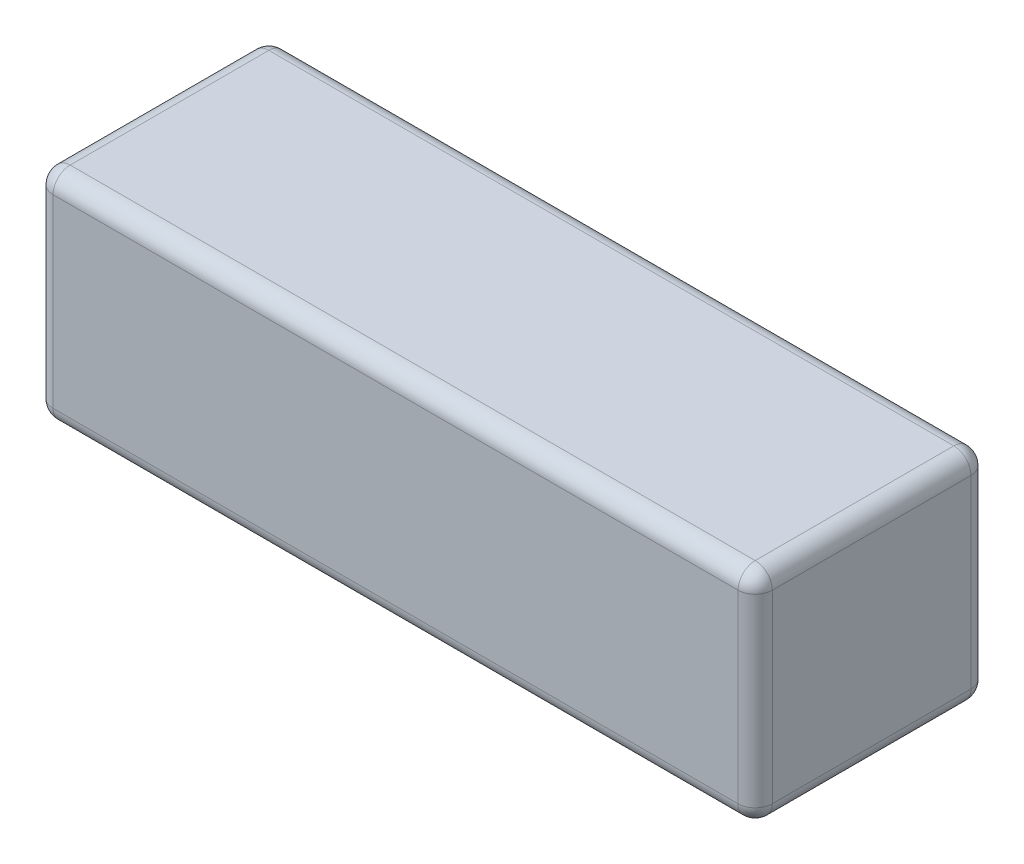
ISO-10303-21;
HEADER;
FILE_DESCRIPTION(('STEP AP214'),'2;1');
FILE_NAME('part.step','',(''),(''),'','','');
FILE_SCHEMA(('AUTOMOTIVE_DESIGN { 1 0 10303 214 1 1 1 1 }'));
ENDSEC;
DATA;
#1=APPLICATION_CONTEXT('core data for automotive mechanical design processes');
#2=APPLICATION_PROTOCOL_DEFINITION('international standard','automotive_design',2000,#1);
#3=PRODUCT_CONTEXT('',#1,'mechanical');
#4=PRODUCT('Part','Part','',(#3));
#5=PRODUCT_RELATED_PRODUCT_CATEGORY('part','',(#4));
#6=PRODUCT_DEFINITION_FORMATION('','',#4);
#7=PRODUCT_DEFINITION_CONTEXT('part definition',#1,'design');
#8=PRODUCT_DEFINITION('design','',#6,#7);
#9=PRODUCT_DEFINITION_SHAPE('','',#8);
#10=(LENGTH_UNIT() NAMED_UNIT(*) SI_UNIT(.MILLI.,.METRE.));
#11=(NAMED_UNIT(*) PLANE_ANGLE_UNIT() SI_UNIT($,.RADIAN.));
#12=(NAMED_UNIT(*) SI_UNIT($,.STERADIAN.) SOLID_ANGLE_UNIT());
#13=UNCERTAINTY_MEASURE_WITH_UNIT(LENGTH_MEASURE(1.E-05),#10,'distance_accuracy_value','');
#14=(GEOMETRIC_REPRESENTATION_CONTEXT(3) GLOBAL_UNCERTAINTY_ASSIGNED_CONTEXT((#13)) GLOBAL_UNIT_ASSIGNED_CONTEXT((#10,
#11,#12)) REPRESENTATION_CONTEXT('',''));
#15=CARTESIAN_POINT('',(0.,0.,0.));
#16=DIRECTION('',(0.,0.,1.));
#17=DIRECTION('',(1.,0.,0.));
#18=AXIS2_PLACEMENT_3D('',#15,#16,#17);
#19=CARTESIAN_POINT('',(0.,32.,0.));
#20=DIRECTION('',(1.,0.,0.));
#21=DIRECTION('',(0.,0.,-1.));
#22=AXIS2_PLACEMENT_3D('',#19,#20,#21);
#23=PLANE('',#22);
#24=DIRECTION('',(0.,0.,1.));
#25=VECTOR('',#24,1.);
#26=CARTESIAN_POINT('',(0.,2.5,0.));
#27=LINE('',#26,#25);
#28=CARTESIAN_POINT('',(0.,2.5,-31.5));
#29=VERTEX_POINT('',#28);
#30=CARTESIAN_POINT('',(0.,2.5,-2.5));
#31=VERTEX_POINT('',#30);
#32=EDGE_CURVE('E220',#29,#31,#27,.T.);
#33=ORIENTED_EDGE('',*,*,#32,.T.);
#34=DIRECTION('',(0.,-1.,0.));
#35=VECTOR('',#34,1.);
#36=CARTESIAN_POINT('',(0.,32.,-2.5));
#37=LINE('',#36,#35);
#38=CARTESIAN_POINT('',(0.,29.5,-2.5));
#39=VERTEX_POINT('',#38);
#40=EDGE_CURVE('E224',#31,#39,#37,.F.);
#41=ORIENTED_EDGE('',*,*,#40,.T.);
#42=DIRECTION('',(0.,0.,1.));
#43=VECTOR('',#42,1.);
#44=CARTESIAN_POINT('',(0.,29.5,0.));
#45=LINE('',#44,#43);
#46=CARTESIAN_POINT('',(0.,29.5,-31.5));
#47=VERTEX_POINT('',#46);
#48=EDGE_CURVE('E217',#39,#47,#45,.F.);
#49=ORIENTED_EDGE('',*,*,#48,.T.);
#50=DIRECTION('',(0.,-1.,0.));
#51=VECTOR('',#50,1.);
#52=CARTESIAN_POINT('',(0.,32.,-31.5));
#53=LINE('',#52,#51);
#54=EDGE_CURVE('E214',#47,#29,#53,.T.);
#55=ORIENTED_EDGE('',*,*,#54,.T.);
#56=EDGE_LOOP('',(#33,#41,#49,#55));
#57=FACE_BOUND('',#56,.T.);
#58=ADVANCED_FACE('F43',(#57),#23,.F.);
#59=CARTESIAN_POINT('',(0.,32.,0.));
#60=DIRECTION('',(0.,0.,-1.));
#61=DIRECTION('',(-1.,0.,0.));
#62=AXIS2_PLACEMENT_3D('',#59,#60,#61);
#63=PLANE('',#62);
#64=DIRECTION('',(1.,0.,0.));
#65=VECTOR('',#64,1.);
#66=CARTESIAN_POINT('',(0.,29.5,0.));
#67=LINE('',#66,#65);
#68=CARTESIAN_POINT('',(102.5,29.5,0.));
#69=VERTEX_POINT('',#68);
#70=CARTESIAN_POINT('',(2.5,29.5,0.));
#71=VERTEX_POINT('',#70);
#72=EDGE_CURVE('E164',#69,#71,#67,.F.);
#73=ORIENTED_EDGE('',*,*,#72,.T.);
#74=DIRECTION('',(0.,-1.,0.));
#75=VECTOR('',#74,1.);
#76=CARTESIAN_POINT('',(2.5,32.,0.));
#77=LINE('',#76,#75);
#78=CARTESIAN_POINT('',(2.5,2.5,0.));
#79=VERTEX_POINT('',#78);
#80=EDGE_CURVE('E168',#71,#79,#77,.T.);
#81=ORIENTED_EDGE('',*,*,#80,.T.);
#82=DIRECTION('',(1.,0.,0.));
#83=VECTOR('',#82,1.);
#84=CARTESIAN_POINT('',(105.,2.5,0.));
#85=LINE('',#84,#83);
#86=CARTESIAN_POINT('',(102.5,2.5,0.));
#87=VERTEX_POINT('',#86);
#88=EDGE_CURVE('E137',#79,#87,#85,.T.);
#89=ORIENTED_EDGE('',*,*,#88,.T.);
#90=DIRECTION('',(0.,-1.,0.));
#91=VECTOR('',#90,1.);
#92=CARTESIAN_POINT('',(102.5,32.,0.));
#93=LINE('',#92,#91);
#94=EDGE_CURVE('E157',#87,#69,#93,.F.);
#95=ORIENTED_EDGE('',*,*,#94,.T.);
#96=EDGE_LOOP('',(#73,#81,#89,#95));
#97=FACE_BOUND('',#96,.T.);
#98=ADVANCED_FACE('F166',(#97),#63,.F.);
#99=CARTESIAN_POINT('',(105.,32.,0.));
#100=DIRECTION('',(-1.,0.,0.));
#101=DIRECTION('',(0.,0.,1.));
#102=AXIS2_PLACEMENT_3D('',#99,#100,#101);
#103=PLANE('',#102);
#104=DIRECTION('',(0.,0.,-1.));
#105=VECTOR('',#104,1.);
#106=CARTESIAN_POINT('',(105.,29.5,0.));
#107=LINE('',#106,#105);
#108=CARTESIAN_POINT('',(105.,29.5,-31.5));
#109=VERTEX_POINT('',#108);
#110=CARTESIAN_POINT('',(105.,29.5,-2.5));
#111=VERTEX_POINT('',#110);
#112=EDGE_CURVE('E191',#109,#111,#107,.F.);
#113=ORIENTED_EDGE('',*,*,#112,.T.);
#114=DIRECTION('',(0.,-1.,0.));
#115=VECTOR('',#114,1.);
#116=CARTESIAN_POINT('',(105.,32.,-2.5));
#117=LINE('',#116,#115);
#118=CARTESIAN_POINT('',(105.,2.5,-2.5));
#119=VERTEX_POINT('',#118);
#120=EDGE_CURVE('E198',#111,#119,#117,.T.);
#121=ORIENTED_EDGE('',*,*,#120,.T.);
#122=DIRECTION('',(0.,0.,-1.));
#123=VECTOR('',#122,1.);
#124=CARTESIAN_POINT('',(105.,2.5,-34.));
#125=LINE('',#124,#123);
#126=CARTESIAN_POINT('',(105.,2.5,-31.5));
#127=VERTEX_POINT('',#126);
#128=EDGE_CURVE('E194',#119,#127,#125,.T.);
#129=ORIENTED_EDGE('',*,*,#128,.T.);
#130=DIRECTION('',(0.,-1.,0.));
#131=VECTOR('',#130,1.);
#132=CARTESIAN_POINT('',(105.,32.,-31.5));
#133=LINE('',#132,#131);
#134=EDGE_CURVE('E188',#127,#109,#133,.F.);
#135=ORIENTED_EDGE('',*,*,#134,.T.);
#136=EDGE_LOOP('',(#113,#121,#129,#135));
#137=FACE_BOUND('',#136,.T.);
#138=ADVANCED_FACE('F385',(#137),#103,.F.);
#139=CARTESIAN_POINT('',(0.,32.,-34.));
#140=DIRECTION('',(0.,0.,1.));
#141=DIRECTION('',(1.,0.,0.));
#142=AXIS2_PLACEMENT_3D('',#139,#140,#141);
#143=PLANE('',#142);
#144=DIRECTION('',(-1.,0.,0.));
#145=VECTOR('',#144,1.);
#146=CARTESIAN_POINT('',(0.,2.5,-34.));
#147=LINE('',#146,#145);
#148=CARTESIAN_POINT('',(102.5,2.5,-34.));
#149=VERTEX_POINT('',#148);
#150=CARTESIAN_POINT('',(2.5,2.5,-34.));
#151=VERTEX_POINT('',#150);
#152=EDGE_CURVE('E207',#149,#151,#147,.T.);
#153=ORIENTED_EDGE('',*,*,#152,.T.);
#154=DIRECTION('',(0.,-1.,0.));
#155=VECTOR('',#154,1.);
#156=CARTESIAN_POINT('',(2.5,32.,-34.));
#157=LINE('',#156,#155);
#158=CARTESIAN_POINT('',(2.5,29.5,-34.));
#159=VERTEX_POINT('',#158);
#160=EDGE_CURVE('E211',#151,#159,#157,.F.);
#161=ORIENTED_EDGE('',*,*,#160,.T.);
#162=DIRECTION('',(-1.,0.,0.));
#163=VECTOR('',#162,1.);
#164=CARTESIAN_POINT('',(0.,29.5,-34.));
#165=LINE('',#164,#163);
#166=CARTESIAN_POINT('',(102.5,29.5,-34.));
#167=VERTEX_POINT('',#166);
#168=EDGE_CURVE('E204',#159,#167,#165,.F.);
#169=ORIENTED_EDGE('',*,*,#168,.T.);
#170=DIRECTION('',(0.,-1.,0.));
#171=VECTOR('',#170,1.);
#172=CARTESIAN_POINT('',(102.5,32.,-34.));
#173=LINE('',#172,#171);
#174=EDGE_CURVE('E201',#167,#149,#173,.T.);
#175=ORIENTED_EDGE('',*,*,#174,.T.);
#176=EDGE_LOOP('',(#153,#161,#169,#175));
#177=FACE_BOUND('',#176,.T.);
#178=ADVANCED_FACE('F352',(#177),#143,.F.);
#179=CARTESIAN_POINT('',(0.,32.,0.));
#180=DIRECTION('',(0.,-1.,0.));
#181=DIRECTION('',(0.,0.,-1.));
#182=AXIS2_PLACEMENT_3D('',#179,#180,#181);
#183=PLANE('',#182);
#184=DIRECTION('',(0.,0.,-1.));
#185=VECTOR('',#184,1.);
#186=CARTESIAN_POINT('',(102.5,32.,0.));
#187=LINE('',#186,#185);
#188=CARTESIAN_POINT('',(102.5,32.,-2.5));
#189=VERTEX_POINT('',#188);
#190=CARTESIAN_POINT('',(102.5,32.,-31.5));
#191=VERTEX_POINT('',#190);
#192=EDGE_CURVE('E53',#189,#191,#187,.T.);
#193=ORIENTED_EDGE('',*,*,#192,.T.);
#194=DIRECTION('',(-1.,0.,0.));
#195=VECTOR('',#194,1.);
#196=CARTESIAN_POINT('',(0.,32.,-31.5));
#197=LINE('',#196,#195);
#198=CARTESIAN_POINT('',(2.5,32.,-31.5));
#199=VERTEX_POINT('',#198);
#200=EDGE_CURVE('E11',#191,#199,#197,.T.);
#201=ORIENTED_EDGE('',*,*,#200,.T.);
#202=DIRECTION('',(0.,0.,1.));
#203=VECTOR('',#202,1.);
#204=CARTESIAN_POINT('',(2.5,32.,0.));
#205=LINE('',#204,#203);
#206=CARTESIAN_POINT('',(2.5,32.,-2.5));
#207=VERTEX_POINT('',#206);
#208=EDGE_CURVE('E227',#199,#207,#205,.T.);
#209=ORIENTED_EDGE('',*,*,#208,.T.);
#210=DIRECTION('',(1.,0.,0.));
#211=VECTOR('',#210,1.);
#212=CARTESIAN_POINT('',(0.,32.,-2.5));
#213=LINE('',#212,#211);
#214=EDGE_CURVE('E64',#207,#189,#213,.T.);
#215=ORIENTED_EDGE('',*,*,#214,.T.);
#216=EDGE_LOOP('',(#193,#201,#209,#215));
#217=FACE_BOUND('',#216,.T.);
#218=ADVANCED_FACE('F332',(#217),#183,.F.);
#219=CARTESIAN_POINT('',(0.,0.,0.));
#220=DIRECTION('',(0.,-1.,0.));
#221=DIRECTION('',(0.,0.,-1.));
#222=AXIS2_PLACEMENT_3D('',#219,#220,#221);
#223=PLANE('',#222);
#224=DIRECTION('',(0.,0.,-1.));
#225=VECTOR('',#224,1.);
#226=CARTESIAN_POINT('',(102.5,0.,0.));
#227=LINE('',#226,#225);
#228=CARTESIAN_POINT('',(102.5,0.,-31.5));
#229=VERTEX_POINT('',#228);
#230=CARTESIAN_POINT('',(102.5,0.,-2.5));
#231=VERTEX_POINT('',#230);
#232=EDGE_CURVE('E183',#229,#231,#227,.F.);
#233=ORIENTED_EDGE('',*,*,#232,.T.);
#234=DIRECTION('',(1.,0.,0.));
#235=VECTOR('',#234,1.);
#236=CARTESIAN_POINT('',(0.,0.,-2.5));
#237=LINE('',#236,#235);
#238=CARTESIAN_POINT('',(2.5,0.,-2.5));
#239=VERTEX_POINT('',#238);
#240=EDGE_CURVE('E139',#231,#239,#237,.F.);
#241=ORIENTED_EDGE('',*,*,#240,.T.);
#242=DIRECTION('',(0.,0.,1.));
#243=VECTOR('',#242,1.);
#244=CARTESIAN_POINT('',(2.5,0.,-34.));
#245=LINE('',#244,#243);
#246=CARTESIAN_POINT('',(2.5,0.,-31.5));
#247=VERTEX_POINT('',#246);
#248=EDGE_CURVE('E174',#239,#247,#245,.F.);
#249=ORIENTED_EDGE('',*,*,#248,.T.);
#250=DIRECTION('',(-1.,0.,0.));
#251=VECTOR('',#250,1.);
#252=CARTESIAN_POINT('',(105.,0.,-31.5));
#253=LINE('',#252,#251);
#254=EDGE_CURVE('E180',#247,#229,#253,.F.);
#255=ORIENTED_EDGE('',*,*,#254,.T.);
#256=EDGE_LOOP('',(#233,#241,#249,#255));
#257=FACE_BOUND('',#256,.T.);
#258=ADVANCED_FACE('F413',(#257),#223,.T.);
#259=CARTESIAN_POINT('',(0.,29.5,-31.5));
#260=DIRECTION('',(-1.,0.,0.));
#261=DIRECTION('',(0.,0.,1.));
#262=AXIS2_PLACEMENT_3D('',#259,#260,#261);
#263=CYLINDRICAL_SURFACE('',#262,2.5);
#264=CARTESIAN_POINT('',(2.5,29.5,-31.5));
#265=DIRECTION('',(-1.,0.,0.));
#266=DIRECTION('',(0.,0.,1.));
#267=AXIS2_PLACEMENT_3D('',#264,#265,#266);
#268=CIRCLE('',#267,2.5);
#269=EDGE_CURVE('E47',#199,#159,#268,.T.);
#270=ORIENTED_EDGE('',*,*,#269,.F.);
#271=ORIENTED_EDGE('',*,*,#200,.F.);
#272=CARTESIAN_POINT('',(102.5,29.5,-31.5));
#273=DIRECTION('',(1.,0.,0.));
#274=DIRECTION('',(0.,0.,-1.));
#275=AXIS2_PLACEMENT_3D('',#272,#273,#274);
#276=CIRCLE('',#275,2.5);
#277=EDGE_CURVE('E303',#167,#191,#276,.T.);
#278=ORIENTED_EDGE('',*,*,#277,.F.);
#279=ORIENTED_EDGE('',*,*,#168,.F.);
#280=EDGE_LOOP('',(#270,#271,#278,#279));
#281=FACE_BOUND('',#280,.T.);
#282=ADVANCED_FACE('F45',(#281),#263,.T.);
#283=CARTESIAN_POINT('',(2.5,29.5,-31.5));
#284=DIRECTION('',(0.,0.,-1.));
#285=DIRECTION('',(-1.,0.,0.));
#286=AXIS2_PLACEMENT_3D('',#283,#284,#285);
#287=SPHERICAL_SURFACE('',#286,2.5);
#288=CARTESIAN_POINT('',(2.5,29.5,-31.5));
#289=DIRECTION('',(0.,0.,-1.));
#290=DIRECTION('',(-1.,0.,0.));
#291=AXIS2_PLACEMENT_3D('',#288,#289,#290);
#292=CIRCLE('',#291,2.5);
#293=EDGE_CURVE('E296',#199,#47,#292,.F.);
#294=ORIENTED_EDGE('',*,*,#293,.F.);
#295=ORIENTED_EDGE('',*,*,#269,.T.);
#296=CARTESIAN_POINT('',(2.5,29.5,-31.5));
#297=DIRECTION('',(0.,1.,0.));
#298=DIRECTION('',(0.,0.,1.));
#299=AXIS2_PLACEMENT_3D('',#296,#297,#298);
#300=CIRCLE('',#299,2.5);
#301=EDGE_CURVE('E300',#47,#159,#300,.F.);
#302=ORIENTED_EDGE('',*,*,#301,.F.);
#303=EDGE_LOOP('',(#294,#295,#302));
#304=FACE_BOUND('',#303,.T.);
#305=ADVANCED_FACE('F316',(#304),#287,.T.);
#306=CARTESIAN_POINT('',(102.5,29.5,-31.5));
#307=DIRECTION('',(0.,1.,0.));
#308=DIRECTION('',(0.,0.,1.));
#309=AXIS2_PLACEMENT_3D('',#306,#307,#308);
#310=SPHERICAL_SURFACE('',#309,2.5);
#311=CARTESIAN_POINT('',(102.5,29.5,-31.5));
#312=DIRECTION('',(0.,1.,0.));
#313=DIRECTION('',(0.,0.,1.));
#314=AXIS2_PLACEMENT_3D('',#311,#312,#313);
#315=CIRCLE('',#314,2.5);
#316=EDGE_CURVE('E288',#167,#109,#315,.F.);
#317=ORIENTED_EDGE('',*,*,#316,.F.);
#318=ORIENTED_EDGE('',*,*,#277,.T.);
#319=CARTESIAN_POINT('',(102.5,29.5,-31.5));
#320=DIRECTION('',(0.,0.,-1.));
#321=DIRECTION('',(-1.,0.,0.));
#322=AXIS2_PLACEMENT_3D('',#319,#320,#321);
#323=CIRCLE('',#322,2.5);
#324=EDGE_CURVE('E292',#109,#191,#323,.F.);
#325=ORIENTED_EDGE('',*,*,#324,.F.);
#326=EDGE_LOOP('',(#317,#318,#325));
#327=FACE_BOUND('',#326,.T.);
#328=ADVANCED_FACE('F344',(#327),#310,.T.);
#329=CARTESIAN_POINT('',(2.5,32.,-31.5));
#330=DIRECTION('',(0.,-1.,0.));
#331=DIRECTION('',(0.,0.,-1.));
#332=AXIS2_PLACEMENT_3D('',#329,#330,#331);
#333=CYLINDRICAL_SURFACE('',#332,2.5);
#334=ORIENTED_EDGE('',*,*,#301,.T.);
#335=ORIENTED_EDGE('',*,*,#160,.F.);
#336=CARTESIAN_POINT('',(2.5,2.5,-31.5));
#337=DIRECTION('',(0.,-1.,0.));
#338=DIRECTION('',(0.,0.,-1.));
#339=AXIS2_PLACEMENT_3D('',#336,#337,#338);
#340=CIRCLE('',#339,2.5);
#341=EDGE_CURVE('E281',#29,#151,#340,.T.);
#342=ORIENTED_EDGE('',*,*,#341,.F.);
#343=ORIENTED_EDGE('',*,*,#54,.F.);
#344=EDGE_LOOP('',(#334,#335,#342,#343));
#345=FACE_BOUND('',#344,.T.);
#346=ADVANCED_FACE('F322',(#345),#333,.T.);
#347=CARTESIAN_POINT('',(2.5,29.5,0.));
#348=DIRECTION('',(0.,0.,1.));
#349=DIRECTION('',(1.,0.,0.));
#350=AXIS2_PLACEMENT_3D('',#347,#348,#349);
#351=CYLINDRICAL_SURFACE('',#350,2.5);
#352=ORIENTED_EDGE('',*,*,#293,.T.);
#353=ORIENTED_EDGE('',*,*,#48,.F.);
#354=CARTESIAN_POINT('',(2.5,29.5,-2.5));
#355=DIRECTION('',(0.,0.,1.));
#356=DIRECTION('',(1.,0.,0.));
#357=AXIS2_PLACEMENT_3D('',#354,#355,#356);
#358=CIRCLE('',#357,2.5);
#359=EDGE_CURVE('E277',#207,#39,#358,.T.);
#360=ORIENTED_EDGE('',*,*,#359,.F.);
#361=ORIENTED_EDGE('',*,*,#208,.F.);
#362=EDGE_LOOP('',(#352,#353,#360,#361));
#363=FACE_BOUND('',#362,.T.);
#364=ADVANCED_FACE('F331',(#363),#351,.T.);
#365=CARTESIAN_POINT('',(0.,29.5,-2.5));
#366=DIRECTION('',(1.,0.,0.));
#367=DIRECTION('',(0.,0.,-1.));
#368=AXIS2_PLACEMENT_3D('',#365,#366,#367);
#369=CYLINDRICAL_SURFACE('',#368,2.5);
#370=CARTESIAN_POINT('',(102.5,29.5,-2.5));
#371=DIRECTION('',(1.,0.,0.));
#372=DIRECTION('',(0.,0.,-1.));
#373=AXIS2_PLACEMENT_3D('',#370,#371,#372);
#374=CIRCLE('',#373,2.5);
#375=EDGE_CURVE('E269',#189,#69,#374,.T.);
#376=ORIENTED_EDGE('',*,*,#375,.F.);
#377=ORIENTED_EDGE('',*,*,#214,.F.);
#378=CARTESIAN_POINT('',(2.5,29.5,-2.5));
#379=DIRECTION('',(-1.,0.,0.));
#380=DIRECTION('',(0.,0.,1.));
#381=AXIS2_PLACEMENT_3D('',#378,#379,#380);
#382=CIRCLE('',#381,2.5);
#383=EDGE_CURVE('E273',#71,#207,#382,.T.);
#384=ORIENTED_EDGE('',*,*,#383,.F.);
#385=ORIENTED_EDGE('',*,*,#72,.F.);
#386=EDGE_LOOP('',(#376,#377,#384,#385));
#387=FACE_BOUND('',#386,.T.);
#388=ADVANCED_FACE('F336',(#387),#369,.T.);
#389=CARTESIAN_POINT('',(102.5,29.5,0.));
#390=DIRECTION('',(0.,0.,-1.));
#391=DIRECTION('',(-1.,0.,0.));
#392=AXIS2_PLACEMENT_3D('',#389,#390,#391);
#393=CYLINDRICAL_SURFACE('',#392,2.5);
#394=ORIENTED_EDGE('',*,*,#324,.T.);
#395=ORIENTED_EDGE('',*,*,#192,.F.);
#396=CARTESIAN_POINT('',(102.5,29.5,-2.5));
#397=DIRECTION('',(0.,0.,1.));
#398=DIRECTION('',(1.,0.,0.));
#399=AXIS2_PLACEMENT_3D('',#396,#397,#398);
#400=CIRCLE('',#399,2.5);
#401=EDGE_CURVE('E265',#111,#189,#400,.T.);
#402=ORIENTED_EDGE('',*,*,#401,.F.);
#403=ORIENTED_EDGE('',*,*,#112,.F.);
#404=EDGE_LOOP('',(#394,#395,#402,#403));
#405=FACE_BOUND('',#404,.T.);
#406=ADVANCED_FACE('F343',(#405),#393,.T.);
#407=CARTESIAN_POINT('',(102.5,32.,-31.5));
#408=DIRECTION('',(0.,-1.,0.));
#409=DIRECTION('',(0.,0.,-1.));
#410=AXIS2_PLACEMENT_3D('',#407,#408,#409);
#411=CYLINDRICAL_SURFACE('',#410,2.5);
#412=ORIENTED_EDGE('',*,*,#316,.T.);
#413=ORIENTED_EDGE('',*,*,#134,.F.);
#414=CARTESIAN_POINT('',(102.5,2.5,-31.5));
#415=DIRECTION('',(0.,-1.,0.));
#416=DIRECTION('',(0.,0.,-1.));
#417=AXIS2_PLACEMENT_3D('',#414,#415,#416);
#418=CIRCLE('',#417,2.5);
#419=EDGE_CURVE('E261',#149,#127,#418,.T.);
#420=ORIENTED_EDGE('',*,*,#419,.F.);
#421=ORIENTED_EDGE('',*,*,#174,.F.);
#422=EDGE_LOOP('',(#412,#413,#420,#421));
#423=FACE_BOUND('',#422,.T.);
#424=ADVANCED_FACE('F349',(#423),#411,.T.);
#425=CARTESIAN_POINT('',(0.,2.5,-31.5));
#426=DIRECTION('',(1.,0.,0.));
#427=DIRECTION('',(0.,0.,-1.));
#428=AXIS2_PLACEMENT_3D('',#425,#426,#427);
#429=CYLINDRICAL_SURFACE('',#428,2.5);
#430=CARTESIAN_POINT('',(2.5,2.5,-31.5));
#431=DIRECTION('',(-1.,0.,0.));
#432=DIRECTION('',(0.,0.,1.));
#433=AXIS2_PLACEMENT_3D('',#430,#431,#432);
#434=CIRCLE('',#433,2.5);
#435=EDGE_CURVE('E284',#151,#247,#434,.T.);
#436=ORIENTED_EDGE('',*,*,#435,.F.);
#437=ORIENTED_EDGE('',*,*,#152,.F.);
#438=CARTESIAN_POINT('',(102.5,2.5,-31.5));
#439=DIRECTION('',(1.,0.,0.));
#440=DIRECTION('',(0.,0.,-1.));
#441=AXIS2_PLACEMENT_3D('',#438,#439,#440);
#442=CIRCLE('',#441,2.5);
#443=EDGE_CURVE('E257',#229,#149,#442,.T.);
#444=ORIENTED_EDGE('',*,*,#443,.F.);
#445=ORIENTED_EDGE('',*,*,#254,.F.);
#446=EDGE_LOOP('',(#436,#437,#444,#445));
#447=FACE_BOUND('',#446,.T.);
#448=ADVANCED_FACE('F356',(#447),#429,.T.);
#449=CARTESIAN_POINT('',(2.5,2.5,-31.5));
#450=DIRECTION('',(0.,0.,-1.));
#451=DIRECTION('',(0.,1.,0.));
#452=AXIS2_PLACEMENT_3D('',#449,#450,#451);
#453=SPHERICAL_SURFACE('',#452,2.5);
#454=ORIENTED_EDGE('',*,*,#341,.T.);
#455=ORIENTED_EDGE('',*,*,#435,.T.);
#456=CARTESIAN_POINT('',(2.5,2.5,-31.5));
#457=DIRECTION('',(0.,0.,-1.));
#458=DIRECTION('',(-1.,0.,0.));
#459=AXIS2_PLACEMENT_3D('',#456,#457,#458);
#460=CIRCLE('',#459,2.5);
#461=EDGE_CURVE('E253',#29,#247,#460,.F.);
#462=ORIENTED_EDGE('',*,*,#461,.F.);
#463=EDGE_LOOP('',(#454,#455,#462));
#464=FACE_BOUND('',#463,.T.);
#465=ADVANCED_FACE('F360',(#464),#453,.T.);
#466=CARTESIAN_POINT('',(2.5,29.5,-2.5));
#467=DIRECTION('',(0.,1.,0.));
#468=DIRECTION('',(0.,0.,1.));
#469=AXIS2_PLACEMENT_3D('',#466,#467,#468);
#470=SPHERICAL_SURFACE('',#469,2.5);
#471=ORIENTED_EDGE('',*,*,#383,.T.);
#472=ORIENTED_EDGE('',*,*,#359,.T.);
#473=CARTESIAN_POINT('',(2.5,29.5,-2.5));
#474=DIRECTION('',(0.,1.,0.));
#475=DIRECTION('',(0.,0.,1.));
#476=AXIS2_PLACEMENT_3D('',#473,#474,#475);
#477=CIRCLE('',#476,2.5);
#478=EDGE_CURVE('E249',#71,#39,#477,.F.);
#479=ORIENTED_EDGE('',*,*,#478,.F.);
#480=EDGE_LOOP('',(#471,#472,#479));
#481=FACE_BOUND('',#480,.T.);
#482=ADVANCED_FACE('F370',(#481),#470,.T.);
#483=CARTESIAN_POINT('',(102.5,29.5,-2.5));
#484=DIRECTION('',(0.,1.,0.));
#485=DIRECTION('',(0.,0.,1.));
#486=AXIS2_PLACEMENT_3D('',#483,#484,#485);
#487=SPHERICAL_SURFACE('',#486,2.5);
#488=ORIENTED_EDGE('',*,*,#401,.T.);
#489=ORIENTED_EDGE('',*,*,#375,.T.);
#490=CARTESIAN_POINT('',(102.5,29.5,-2.5));
#491=DIRECTION('',(0.,1.,0.));
#492=DIRECTION('',(0.,0.,1.));
#493=AXIS2_PLACEMENT_3D('',#490,#491,#492);
#494=CIRCLE('',#493,2.5);
#495=EDGE_CURVE('E160',#111,#69,#494,.F.);
#496=ORIENTED_EDGE('',*,*,#495,.F.);
#497=EDGE_LOOP('',(#488,#489,#496));
#498=FACE_BOUND('',#497,.T.);
#499=ADVANCED_FACE('F340',(#498),#487,.T.);
#500=CARTESIAN_POINT('',(102.5,2.5,-31.5));
#501=DIRECTION('',(0.,0.,-1.));
#502=DIRECTION('',(0.,1.,0.));
#503=AXIS2_PLACEMENT_3D('',#500,#501,#502);
#504=SPHERICAL_SURFACE('',#503,2.5);
#505=ORIENTED_EDGE('',*,*,#443,.T.);
#506=ORIENTED_EDGE('',*,*,#419,.T.);
#507=CARTESIAN_POINT('',(102.5,2.5,-31.5));
#508=DIRECTION('',(0.,0.,-1.));
#509=DIRECTION('',(-1.,0.,0.));
#510=AXIS2_PLACEMENT_3D('',#507,#508,#509);
#511=CIRCLE('',#510,2.5);
#512=EDGE_CURVE('E244',#229,#127,#511,.F.);
#513=ORIENTED_EDGE('',*,*,#512,.F.);
#514=EDGE_LOOP('',(#505,#506,#513));
#515=FACE_BOUND('',#514,.T.);
#516=ADVANCED_FACE('F377',(#515),#504,.T.);
#517=CARTESIAN_POINT('',(2.5,2.5,0.));
#518=DIRECTION('',(0.,0.,-1.));
#519=DIRECTION('',(-1.,0.,0.));
#520=AXIS2_PLACEMENT_3D('',#517,#518,#519);
#521=CYLINDRICAL_SURFACE('',#520,2.5);
#522=ORIENTED_EDGE('',*,*,#461,.T.);
#523=ORIENTED_EDGE('',*,*,#248,.F.);
#524=CARTESIAN_POINT('',(2.5,2.5,-2.5));
#525=DIRECTION('',(0.,0.,1.));
#526=DIRECTION('',(1.,0.,0.));
#527=AXIS2_PLACEMENT_3D('',#524,#525,#526);
#528=CIRCLE('',#527,2.5);
#529=EDGE_CURVE('E240',#31,#239,#528,.T.);
#530=ORIENTED_EDGE('',*,*,#529,.F.);
#531=ORIENTED_EDGE('',*,*,#32,.F.);
#532=EDGE_LOOP('',(#522,#523,#530,#531));
#533=FACE_BOUND('',#532,.T.);
#534=ADVANCED_FACE('F363',(#533),#521,.T.);
#535=CARTESIAN_POINT('',(2.5,32.,-2.5));
#536=DIRECTION('',(0.,-1.,0.));
#537=DIRECTION('',(0.,0.,-1.));
#538=AXIS2_PLACEMENT_3D('',#535,#536,#537);
#539=CYLINDRICAL_SURFACE('',#538,2.5);
#540=ORIENTED_EDGE('',*,*,#478,.T.);
#541=ORIENTED_EDGE('',*,*,#40,.F.);
#542=CARTESIAN_POINT('',(2.5,2.5,-2.5));
#543=DIRECTION('',(0.,-1.,0.));
#544=DIRECTION('',(0.,0.,-1.));
#545=AXIS2_PLACEMENT_3D('',#542,#543,#544);
#546=CIRCLE('',#545,2.5);
#547=EDGE_CURVE('E154',#79,#31,#546,.T.);
#548=ORIENTED_EDGE('',*,*,#547,.F.);
#549=ORIENTED_EDGE('',*,*,#80,.F.);
#550=EDGE_LOOP('',(#540,#541,#548,#549));
#551=FACE_BOUND('',#550,.T.);
#552=ADVANCED_FACE('F368',(#551),#539,.T.);
#553=CARTESIAN_POINT('',(102.5,32.,-2.5));
#554=DIRECTION('',(0.,-1.,0.));
#555=DIRECTION('',(0.,0.,-1.));
#556=AXIS2_PLACEMENT_3D('',#553,#554,#555);
#557=CYLINDRICAL_SURFACE('',#556,2.5);
#558=ORIENTED_EDGE('',*,*,#495,.T.);
#559=ORIENTED_EDGE('',*,*,#94,.F.);
#560=CARTESIAN_POINT('',(102.5,2.5,-2.5));
#561=DIRECTION('',(0.,-1.,0.));
#562=DIRECTION('',(0.,0.,-1.));
#563=AXIS2_PLACEMENT_3D('',#560,#561,#562);
#564=CIRCLE('',#563,2.5);
#565=EDGE_CURVE('E146',#119,#87,#564,.T.);
#566=ORIENTED_EDGE('',*,*,#565,.F.);
#567=ORIENTED_EDGE('',*,*,#120,.F.);
#568=EDGE_LOOP('',(#558,#559,#566,#567));
#569=FACE_BOUND('',#568,.T.);
#570=ADVANCED_FACE('F158',(#569),#557,.T.);
#571=CARTESIAN_POINT('',(102.5,2.5,0.));
#572=DIRECTION('',(0.,0.,1.));
#573=DIRECTION('',(1.,0.,0.));
#574=AXIS2_PLACEMENT_3D('',#571,#572,#573);
#575=CYLINDRICAL_SURFACE('',#574,2.5);
#576=ORIENTED_EDGE('',*,*,#512,.T.);
#577=ORIENTED_EDGE('',*,*,#128,.F.);
#578=CARTESIAN_POINT('',(102.5,2.5,-2.5));
#579=DIRECTION('',(0.,0.,1.));
#580=DIRECTION('',(1.,0.,0.));
#581=AXIS2_PLACEMENT_3D('',#578,#579,#580);
#582=CIRCLE('',#581,2.5);
#583=EDGE_CURVE('E150',#231,#119,#582,.T.);
#584=ORIENTED_EDGE('',*,*,#583,.F.);
#585=ORIENTED_EDGE('',*,*,#232,.F.);
#586=EDGE_LOOP('',(#576,#577,#584,#585));
#587=FACE_BOUND('',#586,.T.);
#588=ADVANCED_FACE('F396',(#587),#575,.T.);
#589=CARTESIAN_POINT('',(2.5,2.5,-2.5));
#590=DIRECTION('',(-1.,0.,0.));
#591=DIRECTION('',(0.,-1.,0.));
#592=AXIS2_PLACEMENT_3D('',#589,#590,#591);
#593=SPHERICAL_SURFACE('',#592,2.5);
#594=ORIENTED_EDGE('',*,*,#547,.T.);
#595=ORIENTED_EDGE('',*,*,#529,.T.);
#596=CARTESIAN_POINT('',(2.5,2.5,-2.5));
#597=DIRECTION('',(-1.,0.,0.));
#598=DIRECTION('',(0.,0.,1.));
#599=AXIS2_PLACEMENT_3D('',#596,#597,#598);
#600=CIRCLE('',#599,2.5);
#601=EDGE_CURVE('E143',#79,#239,#600,.F.);
#602=ORIENTED_EDGE('',*,*,#601,.F.);
#603=EDGE_LOOP('',(#594,#595,#602));
#604=FACE_BOUND('',#603,.T.);
#605=ADVANCED_FACE('F393',(#604),#593,.T.);
#606=CARTESIAN_POINT('',(102.5,2.5,-2.5));
#607=DIRECTION('',(1.,0.,0.));
#608=DIRECTION('',(0.,1.,0.));
#609=AXIS2_PLACEMENT_3D('',#606,#607,#608);
#610=SPHERICAL_SURFACE('',#609,2.5);
#611=ORIENTED_EDGE('',*,*,#583,.T.);
#612=ORIENTED_EDGE('',*,*,#565,.T.);
#613=CARTESIAN_POINT('',(102.5,2.5,-2.5));
#614=DIRECTION('',(1.,0.,0.));
#615=DIRECTION('',(0.,0.,-1.));
#616=AXIS2_PLACEMENT_3D('',#613,#614,#615);
#617=CIRCLE('',#616,2.5);
#618=EDGE_CURVE('E133',#231,#87,#617,.F.);
#619=ORIENTED_EDGE('',*,*,#618,.F.);
#620=EDGE_LOOP('',(#611,#612,#619));
#621=FACE_BOUND('',#620,.T.);
#622=ADVANCED_FACE('F148',(#621),#610,.T.);
#623=CARTESIAN_POINT('',(0.,2.5,-2.5));
#624=DIRECTION('',(-1.,0.,0.));
#625=DIRECTION('',(0.,0.,1.));
#626=AXIS2_PLACEMENT_3D('',#623,#624,#625);
#627=CYLINDRICAL_SURFACE('',#626,2.5);
#628=ORIENTED_EDGE('',*,*,#601,.T.);
#629=ORIENTED_EDGE('',*,*,#240,.F.);
#630=ORIENTED_EDGE('',*,*,#618,.T.);
#631=ORIENTED_EDGE('',*,*,#88,.F.);
#632=EDGE_LOOP('',(#628,#629,#630,#631));
#633=FACE_BOUND('',#632,.T.);
#634=ADVANCED_FACE('F135',(#633),#627,.T.);
#635=CLOSED_SHELL('',(#58,#98,#138,#178,#218,#258,#282,#305,#328,#346,#364,#388,#406,#424,#448,
#465,#482,#499,#516,#534,#552,#570,#588,#605,#622,#634));
#636=MANIFOLD_SOLID_BREP('B2',#635);
#637=ADVANCED_BREP_SHAPE_REPRESENTATION('',(#18,#636),#14);
#638=SHAPE_DEFINITION_REPRESENTATION(#9,#637);
ENDSEC;
END-ISO-10303-21;
